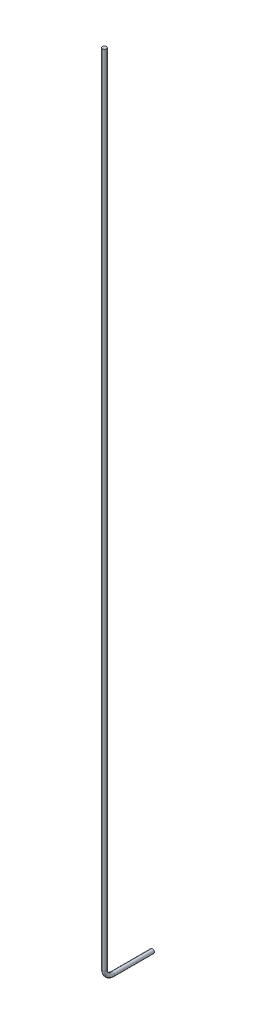
ISO-10303-21;
HEADER;
FILE_DESCRIPTION(('STEP AP214'),'2;1');
FILE_NAME('part.step','',(''),(''),'','','');
FILE_SCHEMA(('AUTOMOTIVE_DESIGN { 1 0 10303 214 1 1 1 1 }'));
ENDSEC;
DATA;
#1=APPLICATION_CONTEXT('core data for automotive mechanical design processes');
#2=APPLICATION_PROTOCOL_DEFINITION('international standard','automotive_design',2000,#1);
#3=PRODUCT_CONTEXT('',#1,'mechanical');
#4=PRODUCT('Part','Part','',(#3));
#5=PRODUCT_RELATED_PRODUCT_CATEGORY('part','',(#4));
#6=PRODUCT_DEFINITION_FORMATION('','',#4);
#7=PRODUCT_DEFINITION_CONTEXT('part definition',#1,'design');
#8=PRODUCT_DEFINITION('design','',#6,#7);
#9=PRODUCT_DEFINITION_SHAPE('','',#8);
#10=(LENGTH_UNIT() NAMED_UNIT(*) SI_UNIT(.MILLI.,.METRE.));
#11=(NAMED_UNIT(*) PLANE_ANGLE_UNIT() SI_UNIT($,.RADIAN.));
#12=(NAMED_UNIT(*) SI_UNIT($,.STERADIAN.) SOLID_ANGLE_UNIT());
#13=UNCERTAINTY_MEASURE_WITH_UNIT(LENGTH_MEASURE(1.E-05),#10,'distance_accuracy_value','');
#14=(GEOMETRIC_REPRESENTATION_CONTEXT(3) GLOBAL_UNCERTAINTY_ASSIGNED_CONTEXT((#13)) GLOBAL_UNIT_ASSIGNED_CONTEXT((#10,
#11,#12)) REPRESENTATION_CONTEXT('',''));
#15=CARTESIAN_POINT('',(0.,0.,0.));
#16=DIRECTION('',(0.,0.,1.));
#17=DIRECTION('',(1.,0.,0.));
#18=AXIS2_PLACEMENT_3D('',#15,#16,#17);
#19=CARTESIAN_POINT('',(0.,0.,20.));
#20=DIRECTION('',(0.,0.,-1.));
#21=DIRECTION('',(-1.,0.,0.));
#22=AXIS2_PLACEMENT_3D('',#19,#20,#21);
#23=CYLINDRICAL_SURFACE('',#22,1.27);
#24=CARTESIAN_POINT('',(0.,0.,0.));
#25=DIRECTION('',(0.,0.,1.));
#26=DIRECTION('',(1.,0.,0.));
#27=AXIS2_PLACEMENT_3D('',#24,#25,#26);
#28=CIRCLE('',#27,1.27);
#29=CARTESIAN_POINT('',(1.27,0.,0.));
#30=VERTEX_POINT('',#29);
#31=EDGE_CURVE('E10',#30,#30,#28,.T.);
#32=ORIENTED_EDGE('',*,*,#31,.T.);
#33=EDGE_LOOP('',(#32));
#34=FACE_BOUND('',#33,.T.);
#35=CARTESIAN_POINT('',(0.,0.,25.));
#36=DIRECTION('',(0.,0.,1.));
#37=DIRECTION('',(1.,0.,0.));
#38=AXIS2_PLACEMENT_3D('',#35,#36,#37);
#39=CIRCLE('',#38,1.27);
#40=CARTESIAN_POINT('',(0.,-1.26999999999984,25.));
#41=VERTEX_POINT('',#40);
#42=EDGE_CURVE('E46',#41,#41,#39,.T.);
#43=ORIENTED_EDGE('',*,*,#42,.F.);
#44=EDGE_LOOP('',(#43));
#45=FACE_BOUND('',#44,.T.);
#46=ADVANCED_FACE('F32',(#34,#45),#23,.T.);
#47=CARTESIAN_POINT('',(0.,0.,0.));
#48=DIRECTION('',(0.,0.,1.));
#49=DIRECTION('',(1.,0.,0.));
#50=AXIS2_PLACEMENT_3D('',#47,#48,#49);
#51=PLANE('',#50);
#52=ORIENTED_EDGE('',*,*,#31,.F.);
#53=EDGE_LOOP('',(#52));
#54=FACE_BOUND('',#53,.T.);
#55=ADVANCED_FACE('F55',(#54),#51,.F.);
#56=CARTESIAN_POINT('',(0.,505.,30.));
#57=DIRECTION('',(0.,1.,0.));
#58=DIRECTION('',(1.,0.,0.));
#59=AXIS2_PLACEMENT_3D('',#56,#57,#58);
#60=PLANE('',#59);
#61=CARTESIAN_POINT('',(0.,505.,30.));
#62=DIRECTION('',(0.,1.,0.));
#63=DIRECTION('',(1.,0.,0.));
#64=AXIS2_PLACEMENT_3D('',#61,#62,#63);
#65=CIRCLE('',#64,1.27);
#66=CARTESIAN_POINT('',(1.27,505.,30.));
#67=VERTEX_POINT('',#66);
#68=EDGE_CURVE('E38',#67,#67,#65,.T.);
#69=ORIENTED_EDGE('',*,*,#68,.T.);
#70=EDGE_LOOP('',(#69));
#71=FACE_BOUND('',#70,.T.);
#72=ADVANCED_FACE('F59',(#71),#60,.T.);
#73=CARTESIAN_POINT('',(0.,5.,25.));
#74=DIRECTION('',(-1.,0.,0.));
#75=DIRECTION('',(0.,0.,1.));
#76=AXIS2_PLACEMENT_3D('',#73,#74,#75);
#77=TOROIDAL_SURFACE('',#76,4.99999999999984,1.27);
#78=CARTESIAN_POINT('',(0.,5.,30.));
#79=DIRECTION('',(0.,1.,0.));
#80=DIRECTION('',(1.,0.,0.));
#81=AXIS2_PLACEMENT_3D('',#78,#79,#80);
#82=CIRCLE('',#81,1.27);
#83=CARTESIAN_POINT('',(0.,5.,31.2699999999998));
#84=VERTEX_POINT('',#83);
#85=EDGE_CURVE('E42',#84,#84,#82,.T.);
#86=CARTESIAN_POINT('',(0.,5.,25.));
#87=DIRECTION('',(-1.,0.,0.));
#88=DIRECTION('',(0.,0.,1.));
#89=AXIS2_PLACEMENT_3D('',#86,#87,#88);
#90=CIRCLE('',#89,6.26999999999984);
#91=EDGE_CURVE('',#41,#84,#90,.T.);
#92=ORIENTED_EDGE('',*,*,#42,.T.);
#93=ORIENTED_EDGE('',*,*,#85,.F.);
#94=ORIENTED_EDGE('',*,*,#91,.T.);
#95=ORIENTED_EDGE('',*,*,#91,.F.);
#96=EDGE_LOOP('',(#92,#94,#93,#95));
#97=FACE_BOUND('',#96,.T.);
#98=ADVANCED_FACE('F52',(#97),#77,.T.);
#99=CARTESIAN_POINT('',(0.,5.,30.));
#100=DIRECTION('',(0.,1.,0.));
#101=DIRECTION('',(0.,0.,1.));
#102=AXIS2_PLACEMENT_3D('',#99,#100,#101);
#103=CYLINDRICAL_SURFACE('',#102,1.27);
#104=ORIENTED_EDGE('',*,*,#68,.F.);
#105=EDGE_LOOP('',(#104));
#106=FACE_BOUND('',#105,.T.);
#107=ORIENTED_EDGE('',*,*,#85,.T.);
#108=EDGE_LOOP('',(#107));
#109=FACE_BOUND('',#108,.T.);
#110=ADVANCED_FACE('F61',(#106,#109),#103,.T.);
#111=CLOSED_SHELL('',(#46,#55,#72,#98,#110));
#112=MANIFOLD_SOLID_BREP('B2',#111);
#113=ADVANCED_BREP_SHAPE_REPRESENTATION('',(#18,#112),#14);
#114=SHAPE_DEFINITION_REPRESENTATION(#9,#113);
ENDSEC;
END-ISO-10303-21;
